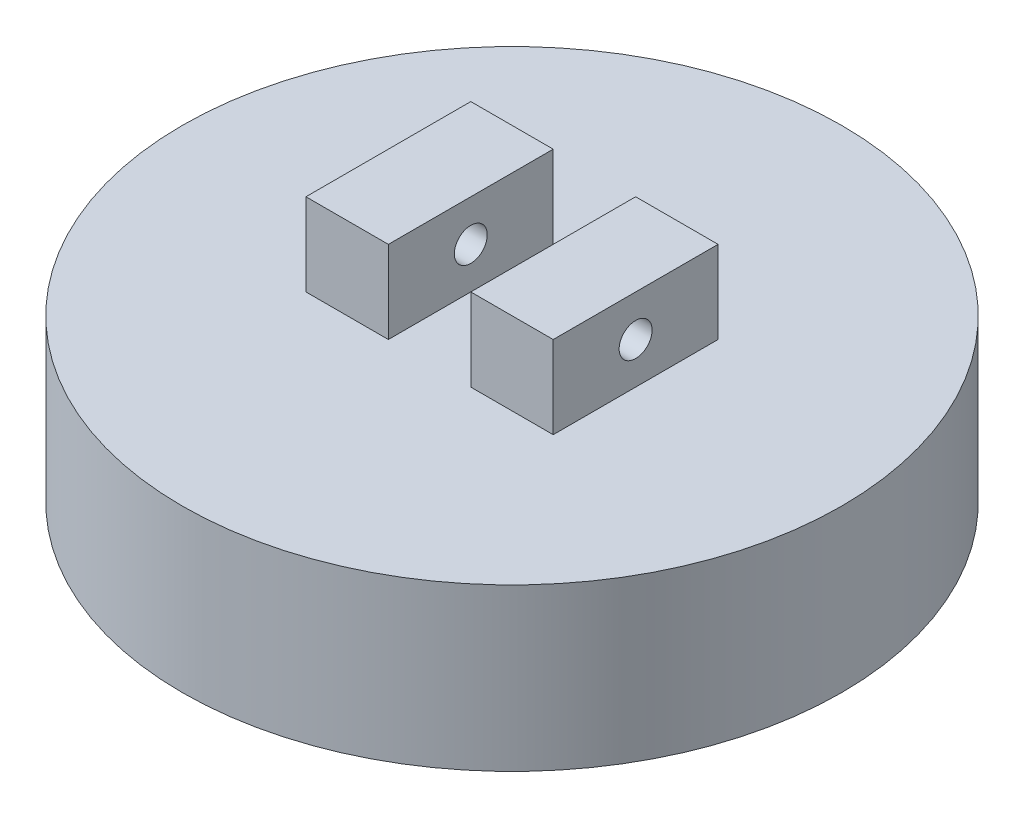
ISO-10303-21;
HEADER;
FILE_DESCRIPTION(('STEP AP214'),'2;1');
FILE_NAME('part.step','',(''),(''),'','','');
FILE_SCHEMA(('AUTOMOTIVE_DESIGN { 1 0 10303 214 1 1 1 1 }'));
ENDSEC;
DATA;
#1=APPLICATION_CONTEXT('core data for automotive mechanical design processes');
#2=APPLICATION_PROTOCOL_DEFINITION('international standard','automotive_design',2000,#1);
#3=PRODUCT_CONTEXT('',#1,'mechanical');
#4=PRODUCT('Part','Part','',(#3));
#5=PRODUCT_RELATED_PRODUCT_CATEGORY('part','',(#4));
#6=PRODUCT_DEFINITION_FORMATION('','',#4);
#7=PRODUCT_DEFINITION_CONTEXT('part definition',#1,'design');
#8=PRODUCT_DEFINITION('design','',#6,#7);
#9=PRODUCT_DEFINITION_SHAPE('','',#8);
#10=(LENGTH_UNIT() NAMED_UNIT(*) SI_UNIT(.MILLI.,.METRE.));
#11=(NAMED_UNIT(*) PLANE_ANGLE_UNIT() SI_UNIT($,.RADIAN.));
#12=(NAMED_UNIT(*) SI_UNIT($,.STERADIAN.) SOLID_ANGLE_UNIT());
#13=UNCERTAINTY_MEASURE_WITH_UNIT(LENGTH_MEASURE(1.E-05),#10,'distance_accuracy_value','');
#14=(GEOMETRIC_REPRESENTATION_CONTEXT(3) GLOBAL_UNCERTAINTY_ASSIGNED_CONTEXT((#13)) GLOBAL_UNIT_ASSIGNED_CONTEXT((#10,
#11,#12)) REPRESENTATION_CONTEXT('',''));
#15=CARTESIAN_POINT('',(0.,0.,0.));
#16=DIRECTION('',(0.,0.,1.));
#17=DIRECTION('',(1.,0.,0.));
#18=AXIS2_PLACEMENT_3D('',#15,#16,#17);
#19=CARTESIAN_POINT('',(0.,9.8,0.));
#20=DIRECTION('',(0.,1.,0.));
#21=DIRECTION('',(0.,0.,1.));
#22=AXIS2_PLACEMENT_3D('',#19,#20,#21);
#23=PLANE('',#22);
#24=CARTESIAN_POINT('',(0.,9.8,0.));
#25=DIRECTION('',(0.,1.,0.));
#26=DIRECTION('',(0.,0.,1.));
#27=AXIS2_PLACEMENT_3D('',#24,#25,#26);
#28=CIRCLE('',#27,20.);
#29=CARTESIAN_POINT('',(0.,9.8,20.));
#30=VERTEX_POINT('',#29);
#31=EDGE_CURVE('E11',#30,#30,#28,.T.);
#32=ORIENTED_EDGE('',*,*,#31,.T.);
#33=EDGE_LOOP('',(#32));
#34=FACE_BOUND('',#33,.T.);
#35=DIRECTION('',(0.,0.,1.));
#36=VECTOR('',#35,1.);
#37=CARTESIAN_POINT('',(2.5,9.8,5.));
#38=LINE('',#37,#36);
#39=CARTESIAN_POINT('',(2.5,9.8,-5.));
#40=VERTEX_POINT('',#39);
#41=CARTESIAN_POINT('',(2.5,9.8,5.));
#42=VERTEX_POINT('',#41);
#43=EDGE_CURVE('E133',#40,#42,#38,.T.);
#44=ORIENTED_EDGE('',*,*,#43,.F.);
#45=DIRECTION('',(-1.,0.,0.));
#46=VECTOR('',#45,1.);
#47=CARTESIAN_POINT('',(2.5,9.8,-5.));
#48=LINE('',#47,#46);
#49=CARTESIAN_POINT('',(7.5,9.8,-5.));
#50=VERTEX_POINT('',#49);
#51=EDGE_CURVE('E130',#50,#40,#48,.T.);
#52=ORIENTED_EDGE('',*,*,#51,.F.);
#53=DIRECTION('',(0.,0.,-1.));
#54=VECTOR('',#53,1.);
#55=CARTESIAN_POINT('',(7.5,9.8,-5.));
#56=LINE('',#55,#54);
#57=CARTESIAN_POINT('',(7.5,9.8,5.));
#58=VERTEX_POINT('',#57);
#59=EDGE_CURVE('E142',#58,#50,#56,.T.);
#60=ORIENTED_EDGE('',*,*,#59,.F.);
#61=DIRECTION('',(1.,0.,0.));
#62=VECTOR('',#61,1.);
#63=CARTESIAN_POINT('',(7.5,9.8,5.));
#64=LINE('',#63,#62);
#65=EDGE_CURVE('E150',#42,#58,#64,.T.);
#66=ORIENTED_EDGE('',*,*,#65,.F.);
#67=EDGE_LOOP('',(#44,#52,#60,#66));
#68=FACE_BOUND('',#67,.T.);
#69=DIRECTION('',(0.,0.,1.));
#70=VECTOR('',#69,1.);
#71=CARTESIAN_POINT('',(-7.5,9.8,-5.));
#72=LINE('',#71,#70);
#73=CARTESIAN_POINT('',(-7.5,9.8,-5.));
#74=VERTEX_POINT('',#73);
#75=CARTESIAN_POINT('',(-7.5,9.8,5.));
#76=VERTEX_POINT('',#75);
#77=EDGE_CURVE('E228',#74,#76,#72,.T.);
#78=ORIENTED_EDGE('',*,*,#77,.F.);
#79=DIRECTION('',(-1.,0.,0.));
#80=VECTOR('',#79,1.);
#81=CARTESIAN_POINT('',(-2.5,9.8,-5.));
#82=LINE('',#81,#80);
#83=CARTESIAN_POINT('',(-2.5,9.8,-5.));
#84=VERTEX_POINT('',#83);
#85=EDGE_CURVE('E128',#84,#74,#82,.T.);
#86=ORIENTED_EDGE('',*,*,#85,.F.);
#87=DIRECTION('',(0.,0.,-1.));
#88=VECTOR('',#87,1.);
#89=CARTESIAN_POINT('',(-2.5,9.8,5.));
#90=LINE('',#89,#88);
#91=CARTESIAN_POINT('',(-2.5,9.8,5.));
#92=VERTEX_POINT('',#91);
#93=EDGE_CURVE('E124',#92,#84,#90,.T.);
#94=ORIENTED_EDGE('',*,*,#93,.F.);
#95=DIRECTION('',(1.,0.,0.));
#96=VECTOR('',#95,1.);
#97=CARTESIAN_POINT('',(-7.5,9.8,5.));
#98=LINE('',#97,#96);
#99=EDGE_CURVE('E237',#76,#92,#98,.T.);
#100=ORIENTED_EDGE('',*,*,#99,.F.);
#101=EDGE_LOOP('',(#78,#86,#94,#100));
#102=FACE_BOUND('',#101,.T.);
#103=ADVANCED_FACE('F37',(#34,#68,#102),#23,.T.);
#104=CARTESIAN_POINT('',(0.,9.8,0.));
#105=DIRECTION('',(0.,-1.,0.));
#106=DIRECTION('',(0.,0.,-1.));
#107=AXIS2_PLACEMENT_3D('',#104,#105,#106);
#108=CYLINDRICAL_SURFACE('',#107,20.);
#109=ORIENTED_EDGE('',*,*,#31,.F.);
#110=EDGE_LOOP('',(#109));
#111=FACE_BOUND('',#110,.T.);
#112=CARTESIAN_POINT('',(0.,0.,0.));
#113=DIRECTION('',(0.,1.,0.));
#114=DIRECTION('',(0.,0.,1.));
#115=AXIS2_PLACEMENT_3D('',#112,#113,#114);
#116=CIRCLE('',#115,20.);
#117=CARTESIAN_POINT('',(0.,0.,20.));
#118=VERTEX_POINT('',#117);
#119=EDGE_CURVE('E46',#118,#118,#116,.T.);
#120=ORIENTED_EDGE('',*,*,#119,.T.);
#121=EDGE_LOOP('',(#120));
#122=FACE_BOUND('',#121,.T.);
#123=ADVANCED_FACE('F39',(#111,#122),#108,.T.);
#124=CARTESIAN_POINT('',(0.,0.,0.));
#125=DIRECTION('',(0.,1.,0.));
#126=DIRECTION('',(0.,0.,1.));
#127=AXIS2_PLACEMENT_3D('',#124,#125,#126);
#128=PLANE('',#127);
#129=ORIENTED_EDGE('',*,*,#119,.F.);
#130=EDGE_LOOP('',(#129));
#131=FACE_BOUND('',#130,.T.);
#132=ADVANCED_FACE('F164',(#131),#128,.F.);
#133=CARTESIAN_POINT('',(2.5,14.8,-5.));
#134=DIRECTION('',(0.,0.,1.));
#135=DIRECTION('',(1.,0.,0.));
#136=AXIS2_PLACEMENT_3D('',#133,#134,#135);
#137=PLANE('',#136);
#138=ORIENTED_EDGE('',*,*,#51,.T.);
#139=DIRECTION('',(0.,-1.,0.));
#140=VECTOR('',#139,1.);
#141=CARTESIAN_POINT('',(2.5,14.8,-5.));
#142=LINE('',#141,#140);
#143=CARTESIAN_POINT('',(2.5,14.8,-5.));
#144=VERTEX_POINT('',#143);
#145=EDGE_CURVE('E159',#144,#40,#142,.T.);
#146=ORIENTED_EDGE('',*,*,#145,.F.);
#147=DIRECTION('',(-1.,0.,0.));
#148=VECTOR('',#147,1.);
#149=CARTESIAN_POINT('',(2.5,14.8,-5.));
#150=LINE('',#149,#148);
#151=CARTESIAN_POINT('',(7.5,14.8,-5.));
#152=VERTEX_POINT('',#151);
#153=EDGE_CURVE('E138',#152,#144,#150,.T.);
#154=ORIENTED_EDGE('',*,*,#153,.F.);
#155=DIRECTION('',(0.,-1.,0.));
#156=VECTOR('',#155,1.);
#157=CARTESIAN_POINT('',(7.5,14.8,-5.));
#158=LINE('',#157,#156);
#159=EDGE_CURVE('E147',#152,#50,#158,.T.);
#160=ORIENTED_EDGE('',*,*,#159,.T.);
#161=EDGE_LOOP('',(#138,#146,#154,#160));
#162=FACE_BOUND('',#161,.T.);
#163=ADVANCED_FACE('F166',(#162),#137,.F.);
#164=CARTESIAN_POINT('',(2.5,14.8,5.));
#165=DIRECTION('',(1.,0.,0.));
#166=DIRECTION('',(0.,0.,-1.));
#167=AXIS2_PLACEMENT_3D('',#164,#165,#166);
#168=PLANE('',#167);
#169=CARTESIAN_POINT('',(2.5,12.3,0.));
#170=DIRECTION('',(1.,0.,0.));
#171=DIRECTION('',(0.,0.,-1.));
#172=AXIS2_PLACEMENT_3D('',#169,#170,#171);
#173=CIRCLE('',#172,1.);
#174=CARTESIAN_POINT('',(2.5,12.3,-1.));
#175=VERTEX_POINT('',#174);
#176=EDGE_CURVE('E226',#175,#175,#173,.T.);
#177=ORIENTED_EDGE('',*,*,#176,.T.);
#178=EDGE_LOOP('',(#177));
#179=FACE_BOUND('',#178,.T.);
#180=ORIENTED_EDGE('',*,*,#43,.T.);
#181=DIRECTION('',(0.,-1.,0.));
#182=VECTOR('',#181,1.);
#183=CARTESIAN_POINT('',(2.5,14.8,5.));
#184=LINE('',#183,#182);
#185=CARTESIAN_POINT('',(2.5,14.8,5.));
#186=VERTEX_POINT('',#185);
#187=EDGE_CURVE('E156',#186,#42,#184,.T.);
#188=ORIENTED_EDGE('',*,*,#187,.F.);
#189=DIRECTION('',(0.,0.,1.));
#190=VECTOR('',#189,1.);
#191=CARTESIAN_POINT('',(2.5,14.8,5.));
#192=LINE('',#191,#190);
#193=EDGE_CURVE('E141',#144,#186,#192,.T.);
#194=ORIENTED_EDGE('',*,*,#193,.F.);
#195=ORIENTED_EDGE('',*,*,#145,.T.);
#196=EDGE_LOOP('',(#180,#188,#194,#195));
#197=FACE_BOUND('',#196,.T.);
#198=ADVANCED_FACE('F172',(#179,#197),#168,.F.);
#199=CARTESIAN_POINT('',(7.5,14.8,5.));
#200=DIRECTION('',(0.,0.,-1.));
#201=DIRECTION('',(-1.,0.,0.));
#202=AXIS2_PLACEMENT_3D('',#199,#200,#201);
#203=PLANE('',#202);
#204=ORIENTED_EDGE('',*,*,#65,.T.);
#205=DIRECTION('',(0.,-1.,0.));
#206=VECTOR('',#205,1.);
#207=CARTESIAN_POINT('',(7.5,14.8,5.));
#208=LINE('',#207,#206);
#209=CARTESIAN_POINT('',(7.5,14.8,5.));
#210=VERTEX_POINT('',#209);
#211=EDGE_CURVE('E62',#210,#58,#208,.T.);
#212=ORIENTED_EDGE('',*,*,#211,.F.);
#213=DIRECTION('',(1.,0.,0.));
#214=VECTOR('',#213,1.);
#215=CARTESIAN_POINT('',(7.5,14.8,5.));
#216=LINE('',#215,#214);
#217=EDGE_CURVE('E144',#186,#210,#216,.T.);
#218=ORIENTED_EDGE('',*,*,#217,.F.);
#219=ORIENTED_EDGE('',*,*,#187,.T.);
#220=EDGE_LOOP('',(#204,#212,#218,#219));
#221=FACE_BOUND('',#220,.T.);
#222=ADVANCED_FACE('F184',(#221),#203,.F.);
#223=CARTESIAN_POINT('',(7.5,14.8,-5.));
#224=DIRECTION('',(-1.,0.,0.));
#225=DIRECTION('',(0.,0.,1.));
#226=AXIS2_PLACEMENT_3D('',#223,#224,#225);
#227=PLANE('',#226);
#228=CARTESIAN_POINT('',(7.5,12.3,0.));
#229=DIRECTION('',(-1.,0.,0.));
#230=DIRECTION('',(0.,0.,1.));
#231=AXIS2_PLACEMENT_3D('',#228,#229,#230);
#232=CIRCLE('',#231,1.);
#233=CARTESIAN_POINT('',(7.5,12.3,0.999999999999999));
#234=VERTEX_POINT('',#233);
#235=EDGE_CURVE('E223',#234,#234,#232,.T.);
#236=ORIENTED_EDGE('',*,*,#235,.T.);
#237=EDGE_LOOP('',(#236));
#238=FACE_BOUND('',#237,.T.);
#239=ORIENTED_EDGE('',*,*,#59,.T.);
#240=ORIENTED_EDGE('',*,*,#159,.F.);
#241=DIRECTION('',(0.,0.,-1.));
#242=VECTOR('',#241,1.);
#243=CARTESIAN_POINT('',(7.5,14.8,-5.));
#244=LINE('',#243,#242);
#245=EDGE_CURVE('E146',#210,#152,#244,.T.);
#246=ORIENTED_EDGE('',*,*,#245,.F.);
#247=ORIENTED_EDGE('',*,*,#211,.T.);
#248=EDGE_LOOP('',(#239,#240,#246,#247));
#249=FACE_BOUND('',#248,.T.);
#250=ADVANCED_FACE('F188',(#238,#249),#227,.F.);
#251=CARTESIAN_POINT('',(0.,14.8,0.));
#252=DIRECTION('',(0.,-1.,0.));
#253=DIRECTION('',(0.,0.,-1.));
#254=AXIS2_PLACEMENT_3D('',#251,#252,#253);
#255=PLANE('',#254);
#256=ORIENTED_EDGE('',*,*,#153,.T.);
#257=ORIENTED_EDGE('',*,*,#193,.T.);
#258=ORIENTED_EDGE('',*,*,#217,.T.);
#259=ORIENTED_EDGE('',*,*,#245,.T.);
#260=EDGE_LOOP('',(#256,#257,#258,#259));
#261=FACE_BOUND('',#260,.T.);
#262=ADVANCED_FACE('F192',(#261),#255,.F.);
#263=CARTESIAN_POINT('',(-2.5,14.8,-5.));
#264=DIRECTION('',(0.,0.,1.));
#265=DIRECTION('',(1.,0.,0.));
#266=AXIS2_PLACEMENT_3D('',#263,#264,#265);
#267=PLANE('',#266);
#268=ORIENTED_EDGE('',*,*,#85,.T.);
#269=DIRECTION('',(0.,-1.,0.));
#270=VECTOR('',#269,1.);
#271=CARTESIAN_POINT('',(-7.5,14.8,-5.));
#272=LINE('',#271,#270);
#273=CARTESIAN_POINT('',(-7.5,14.8,-5.));
#274=VERTEX_POINT('',#273);
#275=EDGE_CURVE('E109',#274,#74,#272,.T.);
#276=ORIENTED_EDGE('',*,*,#275,.F.);
#277=DIRECTION('',(-1.,0.,0.));
#278=VECTOR('',#277,1.);
#279=CARTESIAN_POINT('',(-2.5,14.8,-5.));
#280=LINE('',#279,#278);
#281=CARTESIAN_POINT('',(-2.5,14.8,-5.));
#282=VERTEX_POINT('',#281);
#283=EDGE_CURVE('E116',#282,#274,#280,.T.);
#284=ORIENTED_EDGE('',*,*,#283,.F.);
#285=DIRECTION('',(0.,-1.,0.));
#286=VECTOR('',#285,1.);
#287=CARTESIAN_POINT('',(-2.5,14.8,-5.));
#288=LINE('',#287,#286);
#289=EDGE_CURVE('E234',#282,#84,#288,.T.);
#290=ORIENTED_EDGE('',*,*,#289,.T.);
#291=EDGE_LOOP('',(#268,#276,#284,#290));
#292=FACE_BOUND('',#291,.T.);
#293=ADVANCED_FACE('F126',(#292),#267,.F.);
#294=CARTESIAN_POINT('',(-7.5,14.8,-5.));
#295=DIRECTION('',(1.,0.,0.));
#296=DIRECTION('',(0.,0.,-1.));
#297=AXIS2_PLACEMENT_3D('',#294,#295,#296);
#298=PLANE('',#297);
#299=CARTESIAN_POINT('',(-7.5,12.3,0.));
#300=DIRECTION('',(-1.,0.,0.));
#301=DIRECTION('',(0.,0.,1.));
#302=AXIS2_PLACEMENT_3D('',#299,#300,#301);
#303=CIRCLE('',#302,1.);
#304=CARTESIAN_POINT('',(-7.5,12.3,1.));
#305=VERTEX_POINT('',#304);
#306=EDGE_CURVE('E243',#305,#305,#303,.T.);
#307=ORIENTED_EDGE('',*,*,#306,.F.);
#308=EDGE_LOOP('',(#307));
#309=FACE_BOUND('',#308,.T.);
#310=ORIENTED_EDGE('',*,*,#77,.T.);
#311=DIRECTION('',(0.,-1.,0.));
#312=VECTOR('',#311,1.);
#313=CARTESIAN_POINT('',(-7.5,14.8,5.));
#314=LINE('',#313,#312);
#315=CARTESIAN_POINT('',(-7.5,14.8,5.));
#316=VERTEX_POINT('',#315);
#317=EDGE_CURVE('E112',#316,#76,#314,.T.);
#318=ORIENTED_EDGE('',*,*,#317,.F.);
#319=DIRECTION('',(0.,0.,1.));
#320=VECTOR('',#319,1.);
#321=CARTESIAN_POINT('',(-7.5,14.8,-5.));
#322=LINE('',#321,#320);
#323=EDGE_CURVE('E105',#274,#316,#322,.T.);
#324=ORIENTED_EDGE('',*,*,#323,.F.);
#325=ORIENTED_EDGE('',*,*,#275,.T.);
#326=EDGE_LOOP('',(#310,#318,#324,#325));
#327=FACE_BOUND('',#326,.T.);
#328=ADVANCED_FACE('F107',(#309,#327),#298,.F.);
#329=CARTESIAN_POINT('',(-7.5,14.8,5.));
#330=DIRECTION('',(0.,0.,-1.));
#331=DIRECTION('',(-1.,0.,0.));
#332=AXIS2_PLACEMENT_3D('',#329,#330,#331);
#333=PLANE('',#332);
#334=ORIENTED_EDGE('',*,*,#99,.T.);
#335=DIRECTION('',(0.,-1.,0.));
#336=VECTOR('',#335,1.);
#337=CARTESIAN_POINT('',(-2.5,14.8,5.));
#338=LINE('',#337,#336);
#339=CARTESIAN_POINT('',(-2.5,14.8,5.));
#340=VERTEX_POINT('',#339);
#341=EDGE_CURVE('E54',#340,#92,#338,.T.);
#342=ORIENTED_EDGE('',*,*,#341,.F.);
#343=DIRECTION('',(1.,0.,0.));
#344=VECTOR('',#343,1.);
#345=CARTESIAN_POINT('',(-7.5,14.8,5.));
#346=LINE('',#345,#344);
#347=EDGE_CURVE('E115',#316,#340,#346,.T.);
#348=ORIENTED_EDGE('',*,*,#347,.F.);
#349=ORIENTED_EDGE('',*,*,#317,.T.);
#350=EDGE_LOOP('',(#334,#342,#348,#349));
#351=FACE_BOUND('',#350,.T.);
#352=ADVANCED_FACE('F201',(#351),#333,.F.);
#353=CARTESIAN_POINT('',(-2.5,14.8,5.));
#354=DIRECTION('',(-1.,0.,0.));
#355=DIRECTION('',(0.,0.,1.));
#356=AXIS2_PLACEMENT_3D('',#353,#354,#355);
#357=PLANE('',#356);
#358=CARTESIAN_POINT('',(-2.5,12.3,0.));
#359=DIRECTION('',(-1.,0.,0.));
#360=DIRECTION('',(0.,0.,1.));
#361=AXIS2_PLACEMENT_3D('',#358,#359,#360);
#362=CIRCLE('',#361,1.);
#363=CARTESIAN_POINT('',(-2.5,12.3,1.));
#364=VERTEX_POINT('',#363);
#365=EDGE_CURVE('E41',#364,#364,#362,.T.);
#366=ORIENTED_EDGE('',*,*,#365,.T.);
#367=EDGE_LOOP('',(#366));
#368=FACE_BOUND('',#367,.T.);
#369=ORIENTED_EDGE('',*,*,#93,.T.);
#370=ORIENTED_EDGE('',*,*,#289,.F.);
#371=DIRECTION('',(0.,0.,-1.));
#372=VECTOR('',#371,1.);
#373=CARTESIAN_POINT('',(-2.5,14.8,5.));
#374=LINE('',#373,#372);
#375=EDGE_CURVE('E120',#340,#282,#374,.T.);
#376=ORIENTED_EDGE('',*,*,#375,.F.);
#377=ORIENTED_EDGE('',*,*,#341,.T.);
#378=EDGE_LOOP('',(#369,#370,#376,#377));
#379=FACE_BOUND('',#378,.T.);
#380=ADVANCED_FACE('F205',(#368,#379),#357,.F.);
#381=CARTESIAN_POINT('',(0.,14.8,0.));
#382=DIRECTION('',(0.,1.,0.));
#383=DIRECTION('',(0.,0.,1.));
#384=AXIS2_PLACEMENT_3D('',#381,#382,#383);
#385=PLANE('',#384);
#386=ORIENTED_EDGE('',*,*,#283,.T.);
#387=ORIENTED_EDGE('',*,*,#323,.T.);
#388=ORIENTED_EDGE('',*,*,#347,.T.);
#389=ORIENTED_EDGE('',*,*,#375,.T.);
#390=EDGE_LOOP('',(#386,#387,#388,#389));
#391=FACE_BOUND('',#390,.T.);
#392=ADVANCED_FACE('F119',(#391),#385,.T.);
#393=CARTESIAN_POINT('',(20.,12.3,0.));
#394=DIRECTION('',(-1.,0.,0.));
#395=DIRECTION('',(0.,0.,1.));
#396=AXIS2_PLACEMENT_3D('',#393,#394,#395);
#397=CYLINDRICAL_SURFACE('',#396,1.);
#398=ORIENTED_EDGE('',*,*,#306,.T.);
#399=EDGE_LOOP('',(#398));
#400=FACE_BOUND('',#399,.T.);
#401=ORIENTED_EDGE('',*,*,#365,.F.);
#402=EDGE_LOOP('',(#401));
#403=FACE_BOUND('',#402,.T.);
#404=ADVANCED_FACE('F212',(#400,#403),#397,.F.);
#405=ORIENTED_EDGE('',*,*,#235,.F.);
#406=EDGE_LOOP('',(#405));
#407=FACE_BOUND('',#406,.T.);
#408=ORIENTED_EDGE('',*,*,#176,.F.);
#409=EDGE_LOOP('',(#408));
#410=FACE_BOUND('',#409,.T.);
#411=ADVANCED_FACE('F213',(#407,#410),#397,.F.);
#412=CLOSED_SHELL('',(#103,#123,#132,#163,#198,#222,#250,#262,#293,#328,#352,#380,#392,#404,#411));
#413=MANIFOLD_SOLID_BREP('B2',#412);
#414=ADVANCED_BREP_SHAPE_REPRESENTATION('',(#18,#413),#14);
#415=SHAPE_DEFINITION_REPRESENTATION(#9,#414);
ENDSEC;
END-ISO-10303-21;
